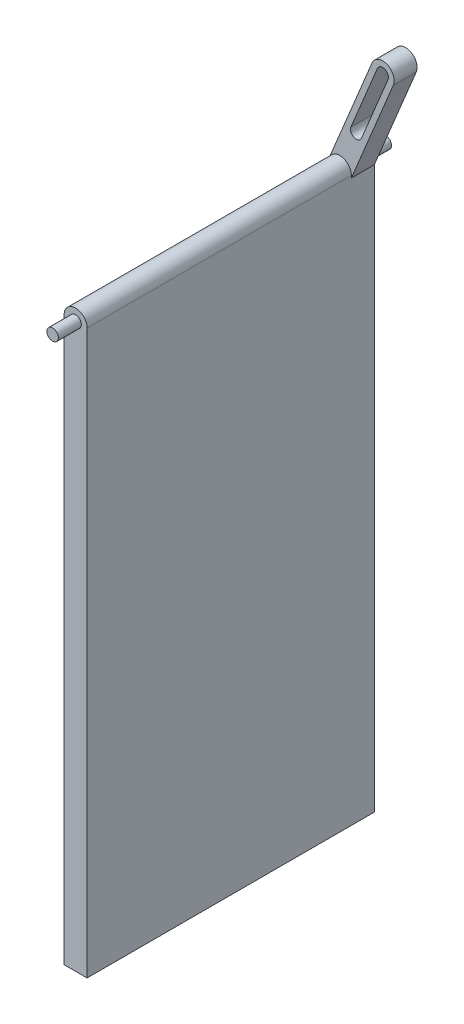
ISO-10303-21;
HEADER;
FILE_DESCRIPTION(('STEP AP214'),'2;1');
FILE_NAME('part.step','',(''),(''),'','','');
FILE_SCHEMA(('AUTOMOTIVE_DESIGN { 1 0 10303 214 1 1 1 1 }'));
ENDSEC;
DATA;
#1=APPLICATION_CONTEXT('core data for automotive mechanical design processes');
#2=APPLICATION_PROTOCOL_DEFINITION('international standard','automotive_design',2000,#1);
#3=PRODUCT_CONTEXT('',#1,'mechanical');
#4=PRODUCT('Part','Part','',(#3));
#5=PRODUCT_RELATED_PRODUCT_CATEGORY('part','',(#4));
#6=PRODUCT_DEFINITION_FORMATION('','',#4);
#7=PRODUCT_DEFINITION_CONTEXT('part definition',#1,'design');
#8=PRODUCT_DEFINITION('design','',#6,#7);
#9=PRODUCT_DEFINITION_SHAPE('','',#8);
#10=(LENGTH_UNIT() NAMED_UNIT(*) SI_UNIT(.MILLI.,.METRE.));
#11=(NAMED_UNIT(*) PLANE_ANGLE_UNIT() SI_UNIT($,.RADIAN.));
#12=(NAMED_UNIT(*) SI_UNIT($,.STERADIAN.) SOLID_ANGLE_UNIT());
#13=UNCERTAINTY_MEASURE_WITH_UNIT(LENGTH_MEASURE(1.E-05),#10,'distance_accuracy_value','');
#14=(GEOMETRIC_REPRESENTATION_CONTEXT(3) GLOBAL_UNCERTAINTY_ASSIGNED_CONTEXT((#13)) GLOBAL_UNIT_ASSIGNED_CONTEXT((#10,
#11,#12)) REPRESENTATION_CONTEXT('',''));
#15=CARTESIAN_POINT('',(0.,0.,0.));
#16=DIRECTION('',(0.,0.,1.));
#17=DIRECTION('',(1.,0.,0.));
#18=AXIS2_PLACEMENT_3D('',#15,#16,#17);
#19=CARTESIAN_POINT('',(-190.,0.,85.1599360511489));
#20=DIRECTION('',(-1.,0.,0.));
#21=DIRECTION('',(0.,0.,1.));
#22=AXIS2_PLACEMENT_3D('',#19,#20,#21);
#23=PLANE('',#22);
#24=DIRECTION('',(0.,0.,-1.));
#25=VECTOR('',#24,1.);
#26=CARTESIAN_POINT('',(-190.,-127.52734618197,-207.));
#27=LINE('',#26,#25);
#28=CARTESIAN_POINT('',(-190.,-127.52734618197,-207.));
#29=VERTEX_POINT('',#28);
#30=CARTESIAN_POINT('',(-190.,-127.52734618197,-215.));
#31=VERTEX_POINT('',#30);
#32=EDGE_CURVE('E146',#29,#31,#27,.T.);
#33=ORIENTED_EDGE('',*,*,#32,.F.);
#34=DIRECTION('',(0.,1.,0.));
#35=VECTOR('',#34,1.);
#36=CARTESIAN_POINT('',(-190.,0.,-207.));
#37=LINE('',#36,#35);
#38=CARTESIAN_POINT('',(-190.,-126.731696712451,-207.));
#39=VERTEX_POINT('',#38);
#40=EDGE_CURVE('E134',#29,#39,#37,.T.);
#41=ORIENTED_EDGE('',*,*,#40,.T.);
#42=DIRECTION('',(0.,0.,-1.));
#43=VECTOR('',#42,1.);
#44=CARTESIAN_POINT('',(-190.,-126.731696712451,85.1599360511489));
#45=LINE('',#44,#43);
#46=CARTESIAN_POINT('',(-190.,-126.731696712451,-115.));
#47=VERTEX_POINT('',#46);
#48=EDGE_CURVE('E229',#47,#39,#45,.T.);
#49=ORIENTED_EDGE('',*,*,#48,.F.);
#50=DIRECTION('',(0.,-1.,0.));
#51=VECTOR('',#50,1.);
#52=CARTESIAN_POINT('',(-190.,0.,-115.));
#53=LINE('',#52,#51);
#54=CARTESIAN_POINT('',(-190.,-322.731696712451,-115.));
#55=VERTEX_POINT('',#54);
#56=EDGE_CURVE('E11',#47,#55,#53,.T.);
#57=ORIENTED_EDGE('',*,*,#56,.T.);
#58=DIRECTION('',(0.,0.,-1.));
#59=VECTOR('',#58,1.);
#60=CARTESIAN_POINT('',(-190.,-322.731696712451,85.1599360511489));
#61=LINE('',#60,#59);
#62=CARTESIAN_POINT('',(-190.,-322.731696712451,-215.));
#63=VERTEX_POINT('',#62);
#64=EDGE_CURVE('E223',#55,#63,#61,.T.);
#65=ORIENTED_EDGE('',*,*,#64,.T.);
#66=DIRECTION('',(0.,1.,0.));
#67=VECTOR('',#66,1.);
#68=CARTESIAN_POINT('',(-190.,0.,-215.));
#69=LINE('',#68,#67);
#70=EDGE_CURVE('E206',#63,#31,#69,.T.);
#71=ORIENTED_EDGE('',*,*,#70,.T.);
#72=EDGE_LOOP('',(#33,#41,#49,#57,#65,#71));
#73=FACE_BOUND('',#72,.T.);
#74=ADVANCED_FACE('F37',(#73),#23,.F.);
#75=CARTESIAN_POINT('',(0.,0.,-215.));
#76=DIRECTION('',(0.,0.,1.));
#77=DIRECTION('',(1.,0.,0.));
#78=AXIS2_PLACEMENT_3D('',#75,#76,#77);
#79=PLANE('',#78);
#80=CARTESIAN_POINT('',(-194.,-126.731696712451,-215.));
#81=DIRECTION('',(0.,0.,1.));
#82=DIRECTION('',(1.,0.,0.));
#83=AXIS2_PLACEMENT_3D('',#80,#81,#82);
#84=CIRCLE('',#83,3.99999999999999);
#85=CARTESIAN_POINT('',(-197.695518130045,-125.200962982991,-215.));
#86=VERTEX_POINT('',#85);
#87=CARTESIAN_POINT('',(-198.,-126.731696712451,-215.));
#88=VERTEX_POINT('',#87);
#89=EDGE_CURVE('E215',#86,#88,#84,.T.);
#90=ORIENTED_EDGE('',*,*,#89,.F.);
#91=DIRECTION('',(0.382683432365092,0.923879532511286,0.));
#92=VECTOR('',#91,1.);
#93=CARTESIAN_POINT('',(-124.478454836814,51.5606642166556,-215.));
#94=LINE('',#93,#92);
#95=CARTESIAN_POINT('',(-182.783829884614,-89.2009629829905,-215.));
#96=VERTEX_POINT('',#95);
#97=EDGE_CURVE('E165',#86,#96,#94,.T.);
#98=ORIENTED_EDGE('',*,*,#97,.T.);
#99=CARTESIAN_POINT('',(-179.088311754569,-90.7316967124509,-215.));
#100=DIRECTION('',(0.,0.,1.));
#101=DIRECTION('',(1.,0.,0.));
#102=AXIS2_PLACEMENT_3D('',#99,#100,#101);
#103=CIRCLE('',#102,4.00000000000001);
#104=CARTESIAN_POINT('',(-175.392793624523,-92.2624304419113,-215.));
#105=VERTEX_POINT('',#104);
#106=EDGE_CURVE('E169',#105,#96,#103,.T.);
#107=ORIENTED_EDGE('',*,*,#106,.F.);
#108=DIRECTION('',(0.382683432365086,0.923879532511288,0.));
#109=VECTOR('',#108,1.);
#110=CARTESIAN_POINT('',(-117.087418576725,48.4991967577346,-215.));
#111=LINE('',#110,#109);
#112=EDGE_CURVE('E142',#31,#105,#111,.T.);
#113=ORIENTED_EDGE('',*,*,#112,.F.);
#114=ORIENTED_EDGE('',*,*,#70,.F.);
#115=DIRECTION('',(1.,0.,0.));
#116=VECTOR('',#115,1.);
#117=CARTESIAN_POINT('',(0.,-322.731696712451,-215.));
#118=LINE('',#117,#116);
#119=CARTESIAN_POINT('',(-198.,-322.731696712451,-215.));
#120=VERTEX_POINT('',#119);
#121=EDGE_CURVE('E220',#120,#63,#118,.T.);
#122=ORIENTED_EDGE('',*,*,#121,.F.);
#123=DIRECTION('',(0.,-1.,0.));
#124=VECTOR('',#123,1.);
#125=CARTESIAN_POINT('',(-198.,0.,-215.));
#126=LINE('',#125,#124);
#127=EDGE_CURVE('E217',#88,#120,#126,.T.);
#128=ORIENTED_EDGE('',*,*,#127,.F.);
#129=EDGE_LOOP('',(#90,#98,#107,#113,#114,#122,#128));
#130=FACE_BOUND('',#129,.T.);
#131=CARTESIAN_POINT('',(-194.,-126.731696712451,-215.));
#132=DIRECTION('',(0.,0.,1.));
#133=DIRECTION('',(1.,0.,0.));
#134=AXIS2_PLACEMENT_3D('',#131,#132,#133);
#135=CIRCLE('',#134,2.);
#136=CARTESIAN_POINT('',(-192.,-126.731696712451,-215.));
#137=VERTEX_POINT('',#136);
#138=EDGE_CURVE('E200',#137,#137,#135,.T.);
#139=ORIENTED_EDGE('',*,*,#138,.T.);
#140=EDGE_LOOP('',(#139));
#141=FACE_BOUND('',#140,.T.);
#142=CARTESIAN_POINT('',(-179.088311754569,-90.7316967124509,-215.));
#143=DIRECTION('',(0.,0.,1.));
#144=DIRECTION('',(1.,0.,0.));
#145=AXIS2_PLACEMENT_3D('',#142,#143,#144);
#146=CIRCLE('',#145,2.);
#147=CARTESIAN_POINT('',(-177.240552689546,-91.497063577181,-215.));
#148=VERTEX_POINT('',#147);
#149=CARTESIAN_POINT('',(-180.936070819591,-89.9663298477207,-215.));
#150=VERTEX_POINT('',#149);
#151=EDGE_CURVE('E171',#148,#150,#146,.T.);
#152=ORIENTED_EDGE('',*,*,#151,.T.);
#153=DIRECTION('',(0.382683432365087,0.923879532511288,0.));
#154=VECTOR('',#153,1.);
#155=CARTESIAN_POINT('',(-122.630695771793,50.7952973519251,-215.));
#156=LINE('',#155,#154);
#157=CARTESIAN_POINT('',(-190.141303024903,-112.189726282577,-215.));
#158=VERTEX_POINT('',#157);
#159=EDGE_CURVE('E180',#158,#150,#156,.T.);
#160=ORIENTED_EDGE('',*,*,#159,.F.);
#161=CARTESIAN_POINT('',(-188.29354395988,-112.955093147308,-215.));
#162=DIRECTION('',(0.,0.,1.));
#163=DIRECTION('',(1.,0.,0.));
#164=AXIS2_PLACEMENT_3D('',#161,#162,#163);
#165=CIRCLE('',#164,2.);
#166=CARTESIAN_POINT('',(-186.445784894858,-113.720460012038,-215.));
#167=VERTEX_POINT('',#166);
#168=EDGE_CURVE('E177',#167,#158,#165,.F.);
#169=ORIENTED_EDGE('',*,*,#168,.F.);
#170=DIRECTION('',(0.382683432365087,0.923879532511288,0.));
#171=VECTOR('',#170,1.);
#172=CARTESIAN_POINT('',(-118.935177641748,49.2645636224648,-215.));
#173=LINE('',#172,#171);
#174=EDGE_CURVE('E174',#167,#148,#173,.T.);
#175=ORIENTED_EDGE('',*,*,#174,.T.);
#176=EDGE_LOOP('',(#152,#160,#169,#175));
#177=FACE_BOUND('',#176,.T.);
#178=ADVANCED_FACE('F247',(#130,#141,#177),#79,.F.);
#179=CARTESIAN_POINT('',(0.,-322.731696712451,85.1599360511489));
#180=DIRECTION('',(0.,1.,0.));
#181=DIRECTION('',(0.,0.,1.));
#182=AXIS2_PLACEMENT_3D('',#179,#180,#181);
#183=PLANE('',#182);
#184=ORIENTED_EDGE('',*,*,#64,.F.);
#185=DIRECTION('',(-1.,0.,0.));
#186=VECTOR('',#185,1.);
#187=CARTESIAN_POINT('',(0.,-322.731696712451,-115.));
#188=LINE('',#187,#186);
#189=CARTESIAN_POINT('',(-198.,-322.731696712451,-115.));
#190=VERTEX_POINT('',#189);
#191=EDGE_CURVE('E40',#55,#190,#188,.T.);
#192=ORIENTED_EDGE('',*,*,#191,.T.);
#193=DIRECTION('',(0.,0.,-1.));
#194=VECTOR('',#193,1.);
#195=CARTESIAN_POINT('',(-198.,-322.731696712451,85.1599360511489));
#196=LINE('',#195,#194);
#197=EDGE_CURVE('E225',#190,#120,#196,.T.);
#198=ORIENTED_EDGE('',*,*,#197,.T.);
#199=ORIENTED_EDGE('',*,*,#121,.T.);
#200=EDGE_LOOP('',(#184,#192,#198,#199));
#201=FACE_BOUND('',#200,.T.);
#202=ADVANCED_FACE('F234',(#201),#183,.F.);
#203=CARTESIAN_POINT('',(-198.,0.,85.1599360511489));
#204=DIRECTION('',(1.,0.,0.));
#205=DIRECTION('',(0.,0.,-1.));
#206=AXIS2_PLACEMENT_3D('',#203,#204,#205);
#207=PLANE('',#206);
#208=ORIENTED_EDGE('',*,*,#197,.F.);
#209=DIRECTION('',(0.,1.,0.));
#210=VECTOR('',#209,1.);
#211=CARTESIAN_POINT('',(-198.,0.,-115.));
#212=LINE('',#211,#210);
#213=CARTESIAN_POINT('',(-198.,-126.731696712451,-115.));
#214=VERTEX_POINT('',#213);
#215=EDGE_CURVE('E209',#190,#214,#212,.T.);
#216=ORIENTED_EDGE('',*,*,#215,.T.);
#217=DIRECTION('',(0.,0.,-1.));
#218=VECTOR('',#217,1.);
#219=CARTESIAN_POINT('',(-198.,-126.731696712451,85.1599360511489));
#220=LINE('',#219,#218);
#221=EDGE_CURVE('E227',#214,#88,#220,.T.);
#222=ORIENTED_EDGE('',*,*,#221,.T.);
#223=ORIENTED_EDGE('',*,*,#127,.T.);
#224=EDGE_LOOP('',(#208,#216,#222,#223));
#225=FACE_BOUND('',#224,.T.);
#226=ADVANCED_FACE('F243',(#225),#207,.F.);
#227=CARTESIAN_POINT('',(-194.,-126.731696712451,85.1599360511489));
#228=DIRECTION('',(0.,0.,-1.));
#229=DIRECTION('',(-1.,0.,0.));
#230=AXIS2_PLACEMENT_3D('',#227,#228,#229);
#231=CYLINDRICAL_SURFACE('',#230,3.99999999999999);
#232=CARTESIAN_POINT('',(-194.,-126.731696712451,-207.));
#233=DIRECTION('',(0.,0.,1.));
#234=DIRECTION('',(1.,0.,0.));
#235=AXIS2_PLACEMENT_3D('',#232,#233,#234);
#236=CIRCLE('',#235,3.99999999999999);
#237=CARTESIAN_POINT('',(-197.695518130045,-125.20096298299,-207.));
#238=VERTEX_POINT('',#237);
#239=EDGE_CURVE('E53',#39,#238,#236,.T.);
#240=ORIENTED_EDGE('',*,*,#239,.T.);
#241=DIRECTION('',(0.,0.,-1.));
#242=VECTOR('',#241,1.);
#243=CARTESIAN_POINT('',(-197.695518130045,-125.200962982991,-207.));
#244=LINE('',#243,#242);
#245=EDGE_CURVE('E57',#238,#86,#244,.T.);
#246=ORIENTED_EDGE('',*,*,#245,.T.);
#247=ORIENTED_EDGE('',*,*,#89,.T.);
#248=ORIENTED_EDGE('',*,*,#221,.F.);
#249=CARTESIAN_POINT('',(-194.,-126.731696712451,-115.));
#250=DIRECTION('',(0.,0.,-1.));
#251=DIRECTION('',(-1.,0.,0.));
#252=AXIS2_PLACEMENT_3D('',#249,#250,#251);
#253=CIRCLE('',#252,3.99999999999999);
#254=EDGE_CURVE('E45',#214,#47,#253,.T.);
#255=ORIENTED_EDGE('',*,*,#254,.T.);
#256=ORIENTED_EDGE('',*,*,#48,.T.);
#257=EDGE_LOOP('',(#240,#246,#247,#248,#255,#256));
#258=FACE_BOUND('',#257,.T.);
#259=ADVANCED_FACE('F240',(#258),#231,.T.);
#260=CARTESIAN_POINT('',(-190.,0.,-115.));
#261=DIRECTION('',(0.,0.,-1.));
#262=DIRECTION('',(-1.,0.,0.));
#263=AXIS2_PLACEMENT_3D('',#260,#261,#262);
#264=PLANE('',#263);
#265=CARTESIAN_POINT('',(-194.,-126.731696712451,-115.));
#266=DIRECTION('',(0.,0.,-1.));
#267=DIRECTION('',(-1.,0.,0.));
#268=AXIS2_PLACEMENT_3D('',#265,#266,#267);
#269=CIRCLE('',#268,2.);
#270=CARTESIAN_POINT('',(-196.,-126.731696712451,-115.));
#271=VERTEX_POINT('',#270);
#272=EDGE_CURVE('E193',#271,#271,#269,.T.);
#273=ORIENTED_EDGE('',*,*,#272,.T.);
#274=EDGE_LOOP('',(#273));
#275=FACE_BOUND('',#274,.T.);
#276=ORIENTED_EDGE('',*,*,#254,.F.);
#277=ORIENTED_EDGE('',*,*,#215,.F.);
#278=ORIENTED_EDGE('',*,*,#191,.F.);
#279=ORIENTED_EDGE('',*,*,#56,.F.);
#280=EDGE_LOOP('',(#276,#277,#278,#279));
#281=FACE_BOUND('',#280,.T.);
#282=ADVANCED_FACE('F237',(#275,#281),#264,.F.);
#283=CARTESIAN_POINT('',(-194.,-126.731696712451,-223.));
#284=DIRECTION('',(0.,0.,1.));
#285=DIRECTION('',(1.,0.,0.));
#286=AXIS2_PLACEMENT_3D('',#283,#284,#285);
#287=CYLINDRICAL_SURFACE('',#286,2.);
#288=CARTESIAN_POINT('',(-194.,-126.731696712451,-223.));
#289=DIRECTION('',(0.,0.,1.));
#290=DIRECTION('',(1.,0.,0.));
#291=AXIS2_PLACEMENT_3D('',#288,#289,#290);
#292=CIRCLE('',#291,2.);
#293=CARTESIAN_POINT('',(-192.,-126.731696712451,-223.));
#294=VERTEX_POINT('',#293);
#295=EDGE_CURVE('E203',#294,#294,#292,.T.);
#296=ORIENTED_EDGE('',*,*,#295,.T.);
#297=EDGE_LOOP('',(#296));
#298=FACE_BOUND('',#297,.T.);
#299=ORIENTED_EDGE('',*,*,#138,.F.);
#300=EDGE_LOOP('',(#299));
#301=FACE_BOUND('',#300,.T.);
#302=ADVANCED_FACE('F283',(#298,#301),#287,.T.);
#303=CARTESIAN_POINT('',(0.,0.,-223.));
#304=DIRECTION('',(0.,0.,1.));
#305=DIRECTION('',(1.,0.,0.));
#306=AXIS2_PLACEMENT_3D('',#303,#304,#305);
#307=PLANE('',#306);
#308=ORIENTED_EDGE('',*,*,#295,.F.);
#309=EDGE_LOOP('',(#308));
#310=FACE_BOUND('',#309,.T.);
#311=ADVANCED_FACE('F288',(#310),#307,.F.);
#312=CARTESIAN_POINT('',(-194.,-126.731696712451,-107.));
#313=DIRECTION('',(0.,0.,-1.));
#314=DIRECTION('',(-1.,0.,0.));
#315=AXIS2_PLACEMENT_3D('',#312,#313,#314);
#316=CYLINDRICAL_SURFACE('',#315,2.);
#317=CARTESIAN_POINT('',(-194.,-126.731696712451,-107.));
#318=DIRECTION('',(0.,0.,-1.));
#319=DIRECTION('',(-1.,0.,0.));
#320=AXIS2_PLACEMENT_3D('',#317,#318,#319);
#321=CIRCLE('',#320,2.);
#322=CARTESIAN_POINT('',(-196.,-126.731696712451,-107.));
#323=VERTEX_POINT('',#322);
#324=EDGE_CURVE('E197',#323,#323,#321,.T.);
#325=ORIENTED_EDGE('',*,*,#324,.T.);
#326=EDGE_LOOP('',(#325));
#327=FACE_BOUND('',#326,.T.);
#328=ORIENTED_EDGE('',*,*,#272,.F.);
#329=EDGE_LOOP('',(#328));
#330=FACE_BOUND('',#329,.T.);
#331=ADVANCED_FACE('F292',(#327,#330),#316,.T.);
#332=CARTESIAN_POINT('',(-194.,-126.731696712451,-107.));
#333=DIRECTION('',(0.,0.,-1.));
#334=DIRECTION('',(-1.,0.,0.));
#335=AXIS2_PLACEMENT_3D('',#332,#333,#334);
#336=PLANE('',#335);
#337=ORIENTED_EDGE('',*,*,#324,.F.);
#338=EDGE_LOOP('',(#337));
#339=FACE_BOUND('',#338,.T.);
#340=ADVANCED_FACE('F294',(#339),#336,.F.);
#341=CARTESIAN_POINT('',(-179.088311754569,-90.7316967124509,-207.));
#342=DIRECTION('',(0.,0.,-1.));
#343=DIRECTION('',(-1.,0.,0.));
#344=AXIS2_PLACEMENT_3D('',#341,#342,#343);
#345=CYLINDRICAL_SURFACE('',#344,2.);
#346=ORIENTED_EDGE('',*,*,#151,.F.);
#347=DIRECTION('',(0.,0.,-1.));
#348=VECTOR('',#347,1.);
#349=CARTESIAN_POINT('',(-177.240552689546,-91.497063577181,-207.));
#350=LINE('',#349,#348);
#351=CARTESIAN_POINT('',(-177.240552689546,-91.497063577181,-207.));
#352=VERTEX_POINT('',#351);
#353=EDGE_CURVE('E191',#352,#148,#350,.T.);
#354=ORIENTED_EDGE('',*,*,#353,.F.);
#355=CARTESIAN_POINT('',(-179.088311754569,-90.7316967124509,-207.));
#356=DIRECTION('',(0.,0.,1.));
#357=DIRECTION('',(1.,0.,0.));
#358=AXIS2_PLACEMENT_3D('',#355,#356,#357);
#359=CIRCLE('',#358,2.);
#360=CARTESIAN_POINT('',(-180.936070819591,-89.9663298477207,-207.));
#361=VERTEX_POINT('',#360);
#362=EDGE_CURVE('E151',#352,#361,#359,.T.);
#363=ORIENTED_EDGE('',*,*,#362,.T.);
#364=DIRECTION('',(0.,0.,-1.));
#365=VECTOR('',#364,1.);
#366=CARTESIAN_POINT('',(-180.936070819591,-89.9663298477207,-207.));
#367=LINE('',#366,#365);
#368=EDGE_CURVE('E184',#361,#150,#367,.T.);
#369=ORIENTED_EDGE('',*,*,#368,.T.);
#370=EDGE_LOOP('',(#346,#354,#363,#369));
#371=FACE_BOUND('',#370,.T.);
#372=ADVANCED_FACE('F301',(#371),#345,.F.);
#373=CARTESIAN_POINT('',(-118.935177641748,49.2645636224648,-207.));
#374=DIRECTION('',(-0.923879532511288,0.382683432365087,0.));
#375=DIRECTION('',(-0.382683432365087,-0.923879532511288,0.));
#376=AXIS2_PLACEMENT_3D('',#373,#374,#375);
#377=PLANE('',#376);
#378=ORIENTED_EDGE('',*,*,#174,.F.);
#379=DIRECTION('',(0.,0.,-1.));
#380=VECTOR('',#379,1.);
#381=CARTESIAN_POINT('',(-186.445784894858,-113.720460012038,-207.));
#382=LINE('',#381,#380);
#383=CARTESIAN_POINT('',(-186.445784894858,-113.720460012038,-207.));
#384=VERTEX_POINT('',#383);
#385=EDGE_CURVE('E189',#384,#167,#382,.T.);
#386=ORIENTED_EDGE('',*,*,#385,.F.);
#387=DIRECTION('',(0.382683432365087,0.923879532511288,0.));
#388=VECTOR('',#387,1.);
#389=CARTESIAN_POINT('',(-118.935177641748,49.2645636224648,-207.));
#390=LINE('',#389,#388);
#391=EDGE_CURVE('E154',#384,#352,#390,.T.);
#392=ORIENTED_EDGE('',*,*,#391,.T.);
#393=ORIENTED_EDGE('',*,*,#353,.T.);
#394=EDGE_LOOP('',(#378,#386,#392,#393));
#395=FACE_BOUND('',#394,.T.);
#396=ADVANCED_FACE('F262',(#395),#377,.T.);
#397=CARTESIAN_POINT('',(-188.29354395988,-112.955093147308,-207.));
#398=DIRECTION('',(0.,0.,-1.));
#399=DIRECTION('',(-1.,0.,0.));
#400=AXIS2_PLACEMENT_3D('',#397,#398,#399);
#401=CYLINDRICAL_SURFACE('',#400,2.);
#402=ORIENTED_EDGE('',*,*,#168,.T.);
#403=DIRECTION('',(0.,0.,-1.));
#404=VECTOR('',#403,1.);
#405=CARTESIAN_POINT('',(-190.141303024903,-112.189726282577,-207.));
#406=LINE('',#405,#404);
#407=CARTESIAN_POINT('',(-190.141303024903,-112.189726282577,-207.));
#408=VERTEX_POINT('',#407);
#409=EDGE_CURVE('E186',#408,#158,#406,.T.);
#410=ORIENTED_EDGE('',*,*,#409,.F.);
#411=CARTESIAN_POINT('',(-188.29354395988,-112.955093147308,-207.));
#412=DIRECTION('',(0.,0.,1.));
#413=DIRECTION('',(1.,0.,0.));
#414=AXIS2_PLACEMENT_3D('',#411,#412,#413);
#415=CIRCLE('',#414,2.);
#416=EDGE_CURVE('E160',#384,#408,#415,.F.);
#417=ORIENTED_EDGE('',*,*,#416,.F.);
#418=ORIENTED_EDGE('',*,*,#385,.T.);
#419=EDGE_LOOP('',(#402,#410,#417,#418));
#420=FACE_BOUND('',#419,.T.);
#421=ADVANCED_FACE('F255',(#420),#401,.F.);
#422=CARTESIAN_POINT('',(-124.478454836814,51.5606642166556,-207.));
#423=DIRECTION('',(-0.923879532511286,0.382683432365092,0.));
#424=DIRECTION('',(-0.382683432365092,-0.923879532511286,0.));
#425=AXIS2_PLACEMENT_3D('',#422,#423,#424);
#426=PLANE('',#425);
#427=ORIENTED_EDGE('',*,*,#97,.F.);
#428=ORIENTED_EDGE('',*,*,#245,.F.);
#429=DIRECTION('',(0.382683432365092,0.923879532511286,0.));
#430=VECTOR('',#429,1.);
#431=CARTESIAN_POINT('',(-124.478454836814,51.5606642166556,-207.));
#432=LINE('',#431,#430);
#433=CARTESIAN_POINT('',(-182.783829884614,-89.2009629829905,-207.));
#434=VERTEX_POINT('',#433);
#435=EDGE_CURVE('E183',#238,#434,#432,.T.);
#436=ORIENTED_EDGE('',*,*,#435,.T.);
#437=DIRECTION('',(0.,0.,-1.));
#438=VECTOR('',#437,1.);
#439=CARTESIAN_POINT('',(-182.783829884614,-89.2009629829905,-207.));
#440=LINE('',#439,#438);
#441=EDGE_CURVE('E147',#434,#96,#440,.T.);
#442=ORIENTED_EDGE('',*,*,#441,.T.);
#443=EDGE_LOOP('',(#427,#428,#436,#442));
#444=FACE_BOUND('',#443,.T.);
#445=ADVANCED_FACE('F251',(#444),#426,.T.);
#446=CARTESIAN_POINT('',(-117.087418576725,48.4991967577346,-207.));
#447=DIRECTION('',(-0.923879532511288,0.382683432365086,0.));
#448=DIRECTION('',(-0.382683432365086,-0.923879532511288,0.));
#449=AXIS2_PLACEMENT_3D('',#446,#447,#448);
#450=PLANE('',#449);
#451=ORIENTED_EDGE('',*,*,#112,.T.);
#452=DIRECTION('',(0.,0.,-1.));
#453=VECTOR('',#452,1.);
#454=CARTESIAN_POINT('',(-175.392793624523,-92.2624304419113,-207.));
#455=LINE('',#454,#453);
#456=CARTESIAN_POINT('',(-175.392793624523,-92.2624304419113,-207.));
#457=VERTEX_POINT('',#456);
#458=EDGE_CURVE('E139',#457,#105,#455,.T.);
#459=ORIENTED_EDGE('',*,*,#458,.F.);
#460=DIRECTION('',(0.382683432365086,0.923879532511288,0.));
#461=VECTOR('',#460,1.);
#462=CARTESIAN_POINT('',(-117.087418576725,48.4991967577346,-207.));
#463=LINE('',#462,#461);
#464=EDGE_CURVE('E126',#29,#457,#463,.T.);
#465=ORIENTED_EDGE('',*,*,#464,.F.);
#466=ORIENTED_EDGE('',*,*,#32,.T.);
#467=EDGE_LOOP('',(#451,#459,#465,#466));
#468=FACE_BOUND('',#467,.T.);
#469=ADVANCED_FACE('F140',(#468),#450,.F.);
#470=CARTESIAN_POINT('',(-179.088311754569,-90.7316967124509,-207.));
#471=DIRECTION('',(0.,0.,-1.));
#472=DIRECTION('',(-1.,0.,0.));
#473=AXIS2_PLACEMENT_3D('',#470,#471,#472);
#474=CYLINDRICAL_SURFACE('',#473,4.00000000000001);
#475=ORIENTED_EDGE('',*,*,#106,.T.);
#476=ORIENTED_EDGE('',*,*,#441,.F.);
#477=CARTESIAN_POINT('',(-179.088311754569,-90.7316967124509,-207.));
#478=DIRECTION('',(0.,0.,1.));
#479=DIRECTION('',(1.,0.,0.));
#480=AXIS2_PLACEMENT_3D('',#477,#478,#479);
#481=CIRCLE('',#480,4.00000000000001);
#482=EDGE_CURVE('E132',#457,#434,#481,.T.);
#483=ORIENTED_EDGE('',*,*,#482,.F.);
#484=ORIENTED_EDGE('',*,*,#458,.T.);
#485=EDGE_LOOP('',(#475,#476,#483,#484));
#486=FACE_BOUND('',#485,.T.);
#487=ADVANCED_FACE('F149',(#486),#474,.T.);
#488=CARTESIAN_POINT('',(-122.630695771793,50.7952973519251,-207.));
#489=DIRECTION('',(-0.923879532511288,0.382683432365087,0.));
#490=DIRECTION('',(-0.382683432365087,-0.923879532511288,0.));
#491=AXIS2_PLACEMENT_3D('',#488,#489,#490);
#492=PLANE('',#491);
#493=ORIENTED_EDGE('',*,*,#159,.T.);
#494=ORIENTED_EDGE('',*,*,#368,.F.);
#495=DIRECTION('',(0.382683432365087,0.923879532511288,0.));
#496=VECTOR('',#495,1.);
#497=CARTESIAN_POINT('',(-122.630695771793,50.7952973519251,-207.));
#498=LINE('',#497,#496);
#499=EDGE_CURVE('E163',#408,#361,#498,.T.);
#500=ORIENTED_EDGE('',*,*,#499,.F.);
#501=ORIENTED_EDGE('',*,*,#409,.T.);
#502=EDGE_LOOP('',(#493,#494,#500,#501));
#503=FACE_BOUND('',#502,.T.);
#504=ADVANCED_FACE('F319',(#503),#492,.F.);
#505=CARTESIAN_POINT('',(0.,0.,-207.));
#506=DIRECTION('',(0.,0.,1.));
#507=DIRECTION('',(1.,0.,0.));
#508=AXIS2_PLACEMENT_3D('',#505,#506,#507);
#509=PLANE('',#508);
#510=ORIENTED_EDGE('',*,*,#435,.F.);
#511=ORIENTED_EDGE('',*,*,#239,.F.);
#512=ORIENTED_EDGE('',*,*,#40,.F.);
#513=ORIENTED_EDGE('',*,*,#464,.T.);
#514=ORIENTED_EDGE('',*,*,#482,.T.);
#515=EDGE_LOOP('',(#510,#511,#512,#513,#514));
#516=FACE_BOUND('',#515,.T.);
#517=ORIENTED_EDGE('',*,*,#362,.F.);
#518=ORIENTED_EDGE('',*,*,#391,.F.);
#519=ORIENTED_EDGE('',*,*,#416,.T.);
#520=ORIENTED_EDGE('',*,*,#499,.T.);
#521=EDGE_LOOP('',(#517,#518,#519,#520));
#522=FACE_BOUND('',#521,.T.);
#523=ADVANCED_FACE('F129',(#516,#522),#509,.T.);
#524=CLOSED_SHELL('',(#74,#178,#202,#226,#259,#282,#302,#311,#331,#340,#372,#396,#421,#445,#469,
#487,#504,#523));
#525=MANIFOLD_SOLID_BREP('B2',#524);
#526=ADVANCED_BREP_SHAPE_REPRESENTATION('',(#18,#525),#14);
#527=SHAPE_DEFINITION_REPRESENTATION(#9,#526);
ENDSEC;
END-ISO-10303-21;
